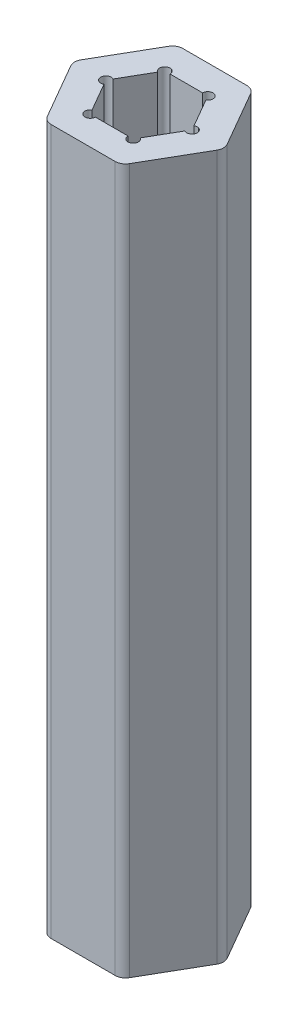
ISO-10303-21;
HEADER;
FILE_DESCRIPTION(('STEP AP214'),'2;1');
FILE_NAME('part.step','',(''),(''),'','','');
FILE_SCHEMA(('AUTOMOTIVE_DESIGN { 1 0 10303 214 1 1 1 1 }'));
ENDSEC;
DATA;
#1=APPLICATION_CONTEXT('core data for automotive mechanical design processes');
#2=APPLICATION_PROTOCOL_DEFINITION('international standard','automotive_design',2000,#1);
#3=PRODUCT_CONTEXT('',#1,'mechanical');
#4=PRODUCT('Part','Part','',(#3));
#5=PRODUCT_RELATED_PRODUCT_CATEGORY('part','',(#4));
#6=PRODUCT_DEFINITION_FORMATION('','',#4);
#7=PRODUCT_DEFINITION_CONTEXT('part definition',#1,'design');
#8=PRODUCT_DEFINITION('design','',#6,#7);
#9=PRODUCT_DEFINITION_SHAPE('','',#8);
#10=(LENGTH_UNIT() NAMED_UNIT(*) SI_UNIT(.MILLI.,.METRE.));
#11=(NAMED_UNIT(*) PLANE_ANGLE_UNIT() SI_UNIT($,.RADIAN.));
#12=(NAMED_UNIT(*) SI_UNIT($,.STERADIAN.) SOLID_ANGLE_UNIT());
#13=UNCERTAINTY_MEASURE_WITH_UNIT(LENGTH_MEASURE(1.E-05),#10,'distance_accuracy_value','');
#14=(GEOMETRIC_REPRESENTATION_CONTEXT(3) GLOBAL_UNCERTAINTY_ASSIGNED_CONTEXT((#13)) GLOBAL_UNIT_ASSIGNED_CONTEXT((#10,
#11,#12)) REPRESENTATION_CONTEXT('',''));
#15=CARTESIAN_POINT('',(0.,0.,0.));
#16=DIRECTION('',(0.,0.,1.));
#17=DIRECTION('',(1.,0.,0.));
#18=AXIS2_PLACEMENT_3D('',#15,#16,#17);
#19=CARTESIAN_POINT('',(0.,68.,0.));
#20=DIRECTION('',(0.,1.,0.));
#21=DIRECTION('',(0.,0.,1.));
#22=AXIS2_PLACEMENT_3D('',#19,#20,#21);
#23=PLANE('',#22);
#24=CARTESIAN_POINT('',(-4.1569219381653,68.,0.));
#25=DIRECTION('',(0.,1.,0.));
#26=DIRECTION('',(0.,0.,1.));
#27=AXIS2_PLACEMENT_3D('',#24,#25,#26);
#28=CIRCLE('',#27,0.5);
#29=CARTESIAN_POINT('',(-3.9069219381653,68.,-0.433012701892219));
#30=VERTEX_POINT('',#29);
#31=CARTESIAN_POINT('',(-3.9069219381653,68.,0.433012701892219));
#32=VERTEX_POINT('',#31);
#33=EDGE_CURVE('E741',#30,#32,#28,.T.);
#34=ORIENTED_EDGE('',*,*,#33,.F.);
#35=DIRECTION('',(-0.5,0.,0.866025403784439));
#36=VECTOR('',#35,1.);
#37=CARTESIAN_POINT('',(-2.07846096908265,68.,-3.6));
#38=LINE('',#37,#36);
#39=CARTESIAN_POINT('',(-2.32846096908265,68.,-3.16698729810778));
#40=VERTEX_POINT('',#39);
#41=EDGE_CURVE('E245',#40,#30,#38,.T.);
#42=ORIENTED_EDGE('',*,*,#41,.F.);
#43=CARTESIAN_POINT('',(-2.07846096908265,68.,-3.6));
#44=DIRECTION('',(0.,1.,0.));
#45=DIRECTION('',(0.,0.,1.));
#46=AXIS2_PLACEMENT_3D('',#43,#44,#45);
#47=CIRCLE('',#46,0.5);
#48=CARTESIAN_POINT('',(-1.57846096908265,68.,-3.6));
#49=VERTEX_POINT('',#48);
#50=EDGE_CURVE('E701',#49,#40,#47,.T.);
#51=ORIENTED_EDGE('',*,*,#50,.F.);
#52=DIRECTION('',(-1.,0.,0.));
#53=VECTOR('',#52,1.);
#54=CARTESIAN_POINT('',(2.07846096908265,68.,-3.6));
#55=LINE('',#54,#53);
#56=CARTESIAN_POINT('',(1.57846096908265,68.,-3.6));
#57=VERTEX_POINT('',#56);
#58=EDGE_CURVE('E239',#57,#49,#55,.T.);
#59=ORIENTED_EDGE('',*,*,#58,.F.);
#60=CARTESIAN_POINT('',(2.07846096908265,68.,-3.6));
#61=DIRECTION('',(0.,1.,0.));
#62=DIRECTION('',(0.,0.,1.));
#63=AXIS2_PLACEMENT_3D('',#60,#61,#62);
#64=CIRCLE('',#63,0.5);
#65=CARTESIAN_POINT('',(2.32846096908265,68.,-3.16698729810778));
#66=VERTEX_POINT('',#65);
#67=EDGE_CURVE('E237',#66,#57,#64,.T.);
#68=ORIENTED_EDGE('',*,*,#67,.F.);
#69=DIRECTION('',(-0.5,0.,-0.866025403784438));
#70=VECTOR('',#69,1.);
#71=CARTESIAN_POINT('',(4.15692193816531,68.,0.));
#72=LINE('',#71,#70);
#73=CARTESIAN_POINT('',(3.90692193816531,68.,-0.43301270189222));
#74=VERTEX_POINT('',#73);
#75=EDGE_CURVE('E227',#74,#66,#72,.T.);
#76=ORIENTED_EDGE('',*,*,#75,.F.);
#77=CARTESIAN_POINT('',(4.15692193816531,68.,0.));
#78=DIRECTION('',(0.,1.,0.));
#79=DIRECTION('',(0.,0.,1.));
#80=AXIS2_PLACEMENT_3D('',#77,#78,#79);
#81=CIRCLE('',#80,0.5);
#82=CARTESIAN_POINT('',(3.90692193816531,68.,0.433012701892218));
#83=VERTEX_POINT('',#82);
#84=EDGE_CURVE('E207',#83,#74,#81,.T.);
#85=ORIENTED_EDGE('',*,*,#84,.F.);
#86=DIRECTION('',(0.5,0.,-0.866025403784439));
#87=VECTOR('',#86,1.);
#88=CARTESIAN_POINT('',(2.07846096908265,68.,3.6));
#89=LINE('',#88,#87);
#90=CARTESIAN_POINT('',(2.32846096908265,68.,3.16698729810778));
#91=VERTEX_POINT('',#90);
#92=EDGE_CURVE('E265',#91,#83,#89,.T.);
#93=ORIENTED_EDGE('',*,*,#92,.F.);
#94=CARTESIAN_POINT('',(2.07846096908265,68.,3.6));
#95=DIRECTION('',(0.,1.,0.));
#96=DIRECTION('',(0.,0.,1.));
#97=AXIS2_PLACEMENT_3D('',#94,#95,#96);
#98=CIRCLE('',#97,0.5);
#99=CARTESIAN_POINT('',(1.57846096908265,68.,3.6));
#100=VERTEX_POINT('',#99);
#101=EDGE_CURVE('E725',#100,#91,#98,.T.);
#102=ORIENTED_EDGE('',*,*,#101,.F.);
#103=DIRECTION('',(1.,0.,0.));
#104=VECTOR('',#103,1.);
#105=CARTESIAN_POINT('',(-2.07846096908265,68.,3.6));
#106=LINE('',#105,#104);
#107=CARTESIAN_POINT('',(-1.57846096908265,68.,3.6));
#108=VERTEX_POINT('',#107);
#109=EDGE_CURVE('E261',#108,#100,#106,.T.);
#110=ORIENTED_EDGE('',*,*,#109,.F.);
#111=CARTESIAN_POINT('',(-2.07846096908265,68.,3.6));
#112=DIRECTION('',(0.,1.,0.));
#113=DIRECTION('',(0.,0.,1.));
#114=AXIS2_PLACEMENT_3D('',#111,#112,#113);
#115=CIRCLE('',#114,0.5);
#116=CARTESIAN_POINT('',(-2.32846096908265,68.,3.16698729810778));
#117=VERTEX_POINT('',#116);
#118=EDGE_CURVE('E734',#117,#108,#115,.T.);
#119=ORIENTED_EDGE('',*,*,#118,.F.);
#120=DIRECTION('',(0.5,0.,0.866025403784439));
#121=VECTOR('',#120,1.);
#122=CARTESIAN_POINT('',(-4.1569219381653,68.,0.));
#123=LINE('',#122,#121);
#124=EDGE_CURVE('E257',#32,#117,#123,.T.);
#125=ORIENTED_EDGE('',*,*,#124,.F.);
#126=EDGE_LOOP('',(#34,#42,#51,#59,#68,#76,#85,#93,#102,#110,#119,#125));
#127=FACE_BOUND('',#126,.T.);
#128=DIRECTION('',(0.5,0.,-0.866025403784439));
#129=VECTOR('',#128,1.);
#130=CARTESIAN_POINT('',(3.66617420935412,68.,6.35));
#131=LINE('',#130,#129);
#132=CARTESIAN_POINT('',(3.95484934394894,68.,5.85));
#133=VERTEX_POINT('',#132);
#134=CARTESIAN_POINT('',(7.04367328411343,68.,0.5));
#135=VERTEX_POINT('',#134);
#136=EDGE_CURVE('E305',#133,#135,#131,.T.);
#137=ORIENTED_EDGE('',*,*,#136,.T.);
#138=CARTESIAN_POINT('',(6.177647880329,68.,0.));
#139=DIRECTION('',(0.,1.,0.));
#140=DIRECTION('',(0.,0.,1.));
#141=AXIS2_PLACEMENT_3D('',#138,#139,#140);
#142=CIRCLE('',#141,1.);
#143=CARTESIAN_POINT('',(7.04367328411343,68.,-0.500000000000001));
#144=VERTEX_POINT('',#143);
#145=EDGE_CURVE('E393',#135,#144,#142,.T.);
#146=ORIENTED_EDGE('',*,*,#145,.T.);
#147=DIRECTION('',(-0.5,0.,-0.866025403784438));
#148=VECTOR('',#147,1.);
#149=CARTESIAN_POINT('',(7.33234841870825,68.,0.));
#150=LINE('',#149,#148);
#151=CARTESIAN_POINT('',(3.95484934394894,68.,-5.85));
#152=VERTEX_POINT('',#151);
#153=EDGE_CURVE('E286',#144,#152,#150,.T.);
#154=ORIENTED_EDGE('',*,*,#153,.T.);
#155=CARTESIAN_POINT('',(3.0888239401645,68.,-5.35));
#156=DIRECTION('',(0.,1.,0.));
#157=DIRECTION('',(0.,0.,1.));
#158=AXIS2_PLACEMENT_3D('',#155,#156,#157);
#159=CIRCLE('',#158,1.);
#160=CARTESIAN_POINT('',(3.0888239401645,68.,-6.35));
#161=VERTEX_POINT('',#160);
#162=EDGE_CURVE('E382',#152,#161,#159,.T.);
#163=ORIENTED_EDGE('',*,*,#162,.T.);
#164=DIRECTION('',(-1.,0.,0.));
#165=VECTOR('',#164,1.);
#166=CARTESIAN_POINT('',(3.66617420935412,68.,-6.35));
#167=LINE('',#166,#165);
#168=CARTESIAN_POINT('',(-3.0888239401645,68.,-6.35));
#169=VERTEX_POINT('',#168);
#170=EDGE_CURVE('E290',#161,#169,#167,.T.);
#171=ORIENTED_EDGE('',*,*,#170,.T.);
#172=CARTESIAN_POINT('',(-3.0888239401645,68.,-5.35));
#173=DIRECTION('',(0.,1.,0.));
#174=DIRECTION('',(0.,0.,1.));
#175=AXIS2_PLACEMENT_3D('',#172,#173,#174);
#176=CIRCLE('',#175,1.);
#177=CARTESIAN_POINT('',(-3.95484934394894,68.,-5.85));
#178=VERTEX_POINT('',#177);
#179=EDGE_CURVE('E385',#169,#178,#176,.T.);
#180=ORIENTED_EDGE('',*,*,#179,.T.);
#181=DIRECTION('',(-0.5,0.,0.866025403784439));
#182=VECTOR('',#181,1.);
#183=CARTESIAN_POINT('',(-3.66617420935412,68.,-6.35));
#184=LINE('',#183,#182);
#185=CARTESIAN_POINT('',(-7.04367328411343,68.,-0.5));
#186=VERTEX_POINT('',#185);
#187=EDGE_CURVE('E295',#178,#186,#184,.T.);
#188=ORIENTED_EDGE('',*,*,#187,.T.);
#189=CARTESIAN_POINT('',(-6.17764788032899,68.,0.));
#190=DIRECTION('',(0.,1.,0.));
#191=DIRECTION('',(0.,0.,1.));
#192=AXIS2_PLACEMENT_3D('',#189,#190,#191);
#193=CIRCLE('',#192,1.);
#194=CARTESIAN_POINT('',(-7.04367328411343,68.,0.5));
#195=VERTEX_POINT('',#194);
#196=EDGE_CURVE('E388',#186,#195,#193,.T.);
#197=ORIENTED_EDGE('',*,*,#196,.T.);
#198=DIRECTION('',(0.5,0.,0.866025403784439));
#199=VECTOR('',#198,1.);
#200=CARTESIAN_POINT('',(-7.33234841870824,68.,0.));
#201=LINE('',#200,#199);
#202=CARTESIAN_POINT('',(-3.95484934394893,68.,5.85));
#203=VERTEX_POINT('',#202);
#204=EDGE_CURVE('E299',#195,#203,#201,.T.);
#205=ORIENTED_EDGE('',*,*,#204,.T.);
#206=CARTESIAN_POINT('',(-3.08882394016449,68.,5.35));
#207=DIRECTION('',(0.,1.,0.));
#208=DIRECTION('',(0.,0.,1.));
#209=AXIS2_PLACEMENT_3D('',#206,#207,#208);
#210=CIRCLE('',#209,1.);
#211=CARTESIAN_POINT('',(-3.08882394016449,68.,6.35));
#212=VERTEX_POINT('',#211);
#213=EDGE_CURVE('E68',#203,#212,#210,.T.);
#214=ORIENTED_EDGE('',*,*,#213,.T.);
#215=DIRECTION('',(1.,0.,0.));
#216=VECTOR('',#215,1.);
#217=CARTESIAN_POINT('',(-3.66617420935412,68.,6.35));
#218=LINE('',#217,#216);
#219=CARTESIAN_POINT('',(3.0888239401645,68.,6.35));
#220=VERTEX_POINT('',#219);
#221=EDGE_CURVE('E302',#212,#220,#218,.T.);
#222=ORIENTED_EDGE('',*,*,#221,.T.);
#223=CARTESIAN_POINT('',(3.0888239401645,68.,5.35));
#224=DIRECTION('',(0.,1.,0.));
#225=DIRECTION('',(0.,0.,1.));
#226=AXIS2_PLACEMENT_3D('',#223,#224,#225);
#227=CIRCLE('',#226,1.);
#228=EDGE_CURVE('E379',#220,#133,#227,.T.);
#229=ORIENTED_EDGE('',*,*,#228,.T.);
#230=EDGE_LOOP('',(#137,#146,#154,#163,#171,#180,#188,#197,#205,#214,#222,#229));
#231=FACE_BOUND('',#230,.T.);
#232=ADVANCED_FACE('F45',(#127,#231),#23,.T.);
#233=CARTESIAN_POINT('',(0.,0.,0.));
#234=DIRECTION('',(0.,1.,0.));
#235=DIRECTION('',(0.,0.,1.));
#236=AXIS2_PLACEMENT_3D('',#233,#234,#235);
#237=PLANE('',#236);
#238=DIRECTION('',(-0.5,0.,-0.866025403784438));
#239=VECTOR('',#238,1.);
#240=CARTESIAN_POINT('',(7.33234841870825,0.,0.));
#241=LINE('',#240,#239);
#242=CARTESIAN_POINT('',(7.04367328411343,0.,-0.500000000000001));
#243=VERTEX_POINT('',#242);
#244=CARTESIAN_POINT('',(3.95484934394894,0.,-5.85));
#245=VERTEX_POINT('',#244);
#246=EDGE_CURVE('E268',#243,#245,#241,.T.);
#247=ORIENTED_EDGE('',*,*,#246,.F.);
#248=CARTESIAN_POINT('',(6.177647880329,0.,0.));
#249=DIRECTION('',(0.,1.,0.));
#250=DIRECTION('',(0.,0.,1.));
#251=AXIS2_PLACEMENT_3D('',#248,#249,#250);
#252=CIRCLE('',#251,1.);
#253=CARTESIAN_POINT('',(7.04367328411343,0.,0.5));
#254=VERTEX_POINT('',#253);
#255=EDGE_CURVE('E369',#243,#254,#252,.F.);
#256=ORIENTED_EDGE('',*,*,#255,.T.);
#257=DIRECTION('',(0.5,0.,-0.866025403784439));
#258=VECTOR('',#257,1.);
#259=CARTESIAN_POINT('',(3.66617420935412,0.,6.35));
#260=LINE('',#259,#258);
#261=CARTESIAN_POINT('',(3.95484934394894,0.,5.85));
#262=VERTEX_POINT('',#261);
#263=EDGE_CURVE('E291',#262,#254,#260,.T.);
#264=ORIENTED_EDGE('',*,*,#263,.F.);
#265=CARTESIAN_POINT('',(3.0888239401645,0.,5.35));
#266=DIRECTION('',(0.,1.,0.));
#267=DIRECTION('',(0.,0.,1.));
#268=AXIS2_PLACEMENT_3D('',#265,#266,#267);
#269=CIRCLE('',#268,1.);
#270=CARTESIAN_POINT('',(3.0888239401645,0.,6.35));
#271=VERTEX_POINT('',#270);
#272=EDGE_CURVE('E354',#262,#271,#269,.F.);
#273=ORIENTED_EDGE('',*,*,#272,.T.);
#274=DIRECTION('',(1.,0.,0.));
#275=VECTOR('',#274,1.);
#276=CARTESIAN_POINT('',(-3.66617420935412,0.,6.35));
#277=LINE('',#276,#275);
#278=CARTESIAN_POINT('',(-3.08882394016449,0.,6.35));
#279=VERTEX_POINT('',#278);
#280=EDGE_CURVE('E324',#279,#271,#277,.T.);
#281=ORIENTED_EDGE('',*,*,#280,.F.);
#282=CARTESIAN_POINT('',(-3.08882394016449,0.,5.35));
#283=DIRECTION('',(0.,1.,0.));
#284=DIRECTION('',(0.,0.,1.));
#285=AXIS2_PLACEMENT_3D('',#282,#283,#284);
#286=CIRCLE('',#285,1.);
#287=CARTESIAN_POINT('',(-3.95484934394893,0.,5.85));
#288=VERTEX_POINT('',#287);
#289=EDGE_CURVE('E366',#279,#288,#286,.F.);
#290=ORIENTED_EDGE('',*,*,#289,.T.);
#291=DIRECTION('',(0.5,0.,0.866025403784439));
#292=VECTOR('',#291,1.);
#293=CARTESIAN_POINT('',(-7.33234841870824,0.,0.));
#294=LINE('',#293,#292);
#295=CARTESIAN_POINT('',(-7.04367328411343,0.,0.5));
#296=VERTEX_POINT('',#295);
#297=EDGE_CURVE('E320',#296,#288,#294,.T.);
#298=ORIENTED_EDGE('',*,*,#297,.F.);
#299=CARTESIAN_POINT('',(-6.17764788032899,0.,0.));
#300=DIRECTION('',(0.,1.,0.));
#301=DIRECTION('',(0.,0.,1.));
#302=AXIS2_PLACEMENT_3D('',#299,#300,#301);
#303=CIRCLE('',#302,1.);
#304=CARTESIAN_POINT('',(-7.04367328411343,0.,-0.5));
#305=VERTEX_POINT('',#304);
#306=EDGE_CURVE('E363',#296,#305,#303,.F.);
#307=ORIENTED_EDGE('',*,*,#306,.T.);
#308=DIRECTION('',(-0.5,0.,0.866025403784439));
#309=VECTOR('',#308,1.);
#310=CARTESIAN_POINT('',(-3.66617420935412,0.,-6.35));
#311=LINE('',#310,#309);
#312=CARTESIAN_POINT('',(-3.95484934394894,0.,-5.85));
#313=VERTEX_POINT('',#312);
#314=EDGE_CURVE('E316',#313,#305,#311,.T.);
#315=ORIENTED_EDGE('',*,*,#314,.F.);
#316=CARTESIAN_POINT('',(-3.0888239401645,0.,-5.35));
#317=DIRECTION('',(0.,1.,0.));
#318=DIRECTION('',(0.,0.,1.));
#319=AXIS2_PLACEMENT_3D('',#316,#317,#318);
#320=CIRCLE('',#319,1.);
#321=CARTESIAN_POINT('',(-3.0888239401645,0.,-6.35));
#322=VERTEX_POINT('',#321);
#323=EDGE_CURVE('E360',#313,#322,#320,.F.);
#324=ORIENTED_EDGE('',*,*,#323,.T.);
#325=DIRECTION('',(-1.,0.,0.));
#326=VECTOR('',#325,1.);
#327=CARTESIAN_POINT('',(3.66617420935412,0.,-6.35));
#328=LINE('',#327,#326);
#329=CARTESIAN_POINT('',(3.0888239401645,0.,-6.35));
#330=VERTEX_POINT('',#329);
#331=EDGE_CURVE('E312',#330,#322,#328,.T.);
#332=ORIENTED_EDGE('',*,*,#331,.F.);
#333=CARTESIAN_POINT('',(3.0888239401645,0.,-5.35));
#334=DIRECTION('',(0.,1.,0.));
#335=DIRECTION('',(0.,0.,1.));
#336=AXIS2_PLACEMENT_3D('',#333,#334,#335);
#337=CIRCLE('',#336,1.);
#338=EDGE_CURVE('E357',#330,#245,#337,.F.);
#339=ORIENTED_EDGE('',*,*,#338,.T.);
#340=EDGE_LOOP('',(#247,#256,#264,#273,#281,#290,#298,#307,#315,#324,#332,#339));
#341=FACE_BOUND('',#340,.T.);
#342=DIRECTION('',(-0.5,0.,0.866025403784439));
#343=VECTOR('',#342,1.);
#344=CARTESIAN_POINT('',(-2.07846096908265,0.,-3.6));
#345=LINE('',#344,#343);
#346=CARTESIAN_POINT('',(-2.32846096908265,0.,-3.16698729810778));
#347=VERTEX_POINT('',#346);
#348=CARTESIAN_POINT('',(-3.9069219381653,0.,-0.433012701892219));
#349=VERTEX_POINT('',#348);
#350=EDGE_CURVE('E275',#347,#349,#345,.T.);
#351=ORIENTED_EDGE('',*,*,#350,.T.);
#352=CARTESIAN_POINT('',(-4.1569219381653,0.,0.));
#353=DIRECTION('',(0.,1.,0.));
#354=DIRECTION('',(0.,0.,1.));
#355=AXIS2_PLACEMENT_3D('',#352,#353,#354);
#356=CIRCLE('',#355,0.5);
#357=CARTESIAN_POINT('',(-3.9069219381653,0.,0.433012701892219));
#358=VERTEX_POINT('',#357);
#359=EDGE_CURVE('E743',#349,#358,#356,.T.);
#360=ORIENTED_EDGE('',*,*,#359,.T.);
#361=DIRECTION('',(0.5,0.,0.866025403784439));
#362=VECTOR('',#361,1.);
#363=CARTESIAN_POINT('',(-4.1569219381653,0.,0.));
#364=LINE('',#363,#362);
#365=CARTESIAN_POINT('',(-2.32846096908265,0.,3.16698729810778));
#366=VERTEX_POINT('',#365);
#367=EDGE_CURVE('E279',#358,#366,#364,.T.);
#368=ORIENTED_EDGE('',*,*,#367,.T.);
#369=CARTESIAN_POINT('',(-2.07846096908265,0.,3.6));
#370=DIRECTION('',(0.,1.,0.));
#371=DIRECTION('',(0.,0.,1.));
#372=AXIS2_PLACEMENT_3D('',#369,#370,#371);
#373=CIRCLE('',#372,0.5);
#374=CARTESIAN_POINT('',(-1.57846096908265,0.,3.6));
#375=VERTEX_POINT('',#374);
#376=EDGE_CURVE('E737',#366,#375,#373,.T.);
#377=ORIENTED_EDGE('',*,*,#376,.T.);
#378=DIRECTION('',(1.,0.,0.));
#379=VECTOR('',#378,1.);
#380=CARTESIAN_POINT('',(-2.07846096908265,0.,3.6));
#381=LINE('',#380,#379);
#382=CARTESIAN_POINT('',(1.57846096908265,0.,3.6));
#383=VERTEX_POINT('',#382);
#384=EDGE_CURVE('E248',#375,#383,#381,.T.);
#385=ORIENTED_EDGE('',*,*,#384,.T.);
#386=CARTESIAN_POINT('',(2.07846096908265,0.,3.6));
#387=DIRECTION('',(0.,1.,0.));
#388=DIRECTION('',(0.,0.,1.));
#389=AXIS2_PLACEMENT_3D('',#386,#387,#388);
#390=CIRCLE('',#389,0.5);
#391=CARTESIAN_POINT('',(2.32846096908265,0.,3.16698729810778));
#392=VERTEX_POINT('',#391);
#393=EDGE_CURVE('E728',#383,#392,#390,.T.);
#394=ORIENTED_EDGE('',*,*,#393,.T.);
#395=DIRECTION('',(0.5,0.,-0.866025403784439));
#396=VECTOR('',#395,1.);
#397=CARTESIAN_POINT('',(2.07846096908265,0.,3.6));
#398=LINE('',#397,#396);
#399=CARTESIAN_POINT('',(3.90692193816531,0.,0.43301270189222));
#400=VERTEX_POINT('',#399);
#401=EDGE_CURVE('E240',#392,#400,#398,.T.);
#402=ORIENTED_EDGE('',*,*,#401,.T.);
#403=CARTESIAN_POINT('',(4.15692193816531,0.,0.));
#404=DIRECTION('',(0.,1.,0.));
#405=DIRECTION('',(0.,0.,1.));
#406=AXIS2_PLACEMENT_3D('',#403,#404,#405);
#407=CIRCLE('',#406,0.5);
#408=CARTESIAN_POINT('',(3.90692193816531,0.,-0.43301270189222));
#409=VERTEX_POINT('',#408);
#410=EDGE_CURVE('E220',#400,#409,#407,.T.);
#411=ORIENTED_EDGE('',*,*,#410,.T.);
#412=DIRECTION('',(-0.5,0.,-0.866025403784438));
#413=VECTOR('',#412,1.);
#414=CARTESIAN_POINT('',(4.15692193816531,0.,0.));
#415=LINE('',#414,#413);
#416=CARTESIAN_POINT('',(2.32846096908265,0.,-3.16698729810778));
#417=VERTEX_POINT('',#416);
#418=EDGE_CURVE('E229',#409,#417,#415,.T.);
#419=ORIENTED_EDGE('',*,*,#418,.T.);
#420=CARTESIAN_POINT('',(2.07846096908265,0.,-3.6));
#421=DIRECTION('',(0.,1.,0.));
#422=DIRECTION('',(0.,0.,1.));
#423=AXIS2_PLACEMENT_3D('',#420,#421,#422);
#424=CIRCLE('',#423,0.5);
#425=CARTESIAN_POINT('',(1.57846096908265,0.,-3.6));
#426=VERTEX_POINT('',#425);
#427=EDGE_CURVE('E219',#417,#426,#424,.T.);
#428=ORIENTED_EDGE('',*,*,#427,.T.);
#429=DIRECTION('',(-1.,0.,0.));
#430=VECTOR('',#429,1.);
#431=CARTESIAN_POINT('',(2.07846096908265,0.,-3.6));
#432=LINE('',#431,#430);
#433=CARTESIAN_POINT('',(-1.57846096908265,0.,-3.6));
#434=VERTEX_POINT('',#433);
#435=EDGE_CURVE('E271',#426,#434,#432,.T.);
#436=ORIENTED_EDGE('',*,*,#435,.T.);
#437=CARTESIAN_POINT('',(-2.07846096908265,0.,-3.6));
#438=DIRECTION('',(0.,1.,0.));
#439=DIRECTION('',(0.,0.,1.));
#440=AXIS2_PLACEMENT_3D('',#437,#438,#439);
#441=CIRCLE('',#440,0.5);
#442=EDGE_CURVE('E232',#434,#347,#441,.T.);
#443=ORIENTED_EDGE('',*,*,#442,.T.);
#444=EDGE_LOOP('',(#351,#360,#368,#377,#385,#394,#402,#411,#419,#428,#436,#443));
#445=FACE_BOUND('',#444,.T.);
#446=ADVANCED_FACE('F427',(#341,#445),#237,.F.);
#447=CARTESIAN_POINT('',(7.33234841870825,68.,0.));
#448=DIRECTION('',(-0.866025403784439,0.,0.5));
#449=DIRECTION('',(0.5,0.,0.866025403784438));
#450=AXIS2_PLACEMENT_3D('',#447,#448,#449);
#451=PLANE('',#450);
#452=ORIENTED_EDGE('',*,*,#153,.F.);
#453=DIRECTION('',(0.,-1.,0.));
#454=VECTOR('',#453,1.);
#455=CARTESIAN_POINT('',(7.04367328411343,68.,-0.500000000000001));
#456=LINE('',#455,#454);
#457=EDGE_CURVE('E350',#144,#243,#456,.T.);
#458=ORIENTED_EDGE('',*,*,#457,.T.);
#459=ORIENTED_EDGE('',*,*,#246,.T.);
#460=DIRECTION('',(0.,-1.,0.));
#461=VECTOR('',#460,1.);
#462=CARTESIAN_POINT('',(3.95484934394894,68.,-5.85));
#463=LINE('',#462,#461);
#464=EDGE_CURVE('E347',#245,#152,#463,.F.);
#465=ORIENTED_EDGE('',*,*,#464,.T.);
#466=EDGE_LOOP('',(#452,#458,#459,#465));
#467=FACE_BOUND('',#466,.T.);
#468=ADVANCED_FACE('F466',(#467),#451,.F.);
#469=CARTESIAN_POINT('',(3.66617420935412,68.,-6.35));
#470=DIRECTION('',(0.,0.,1.));
#471=DIRECTION('',(1.,0.,0.));
#472=AXIS2_PLACEMENT_3D('',#469,#470,#471);
#473=PLANE('',#472);
#474=ORIENTED_EDGE('',*,*,#331,.T.);
#475=DIRECTION('',(0.,-1.,0.));
#476=VECTOR('',#475,1.);
#477=CARTESIAN_POINT('',(-3.0888239401645,68.,-6.35));
#478=LINE('',#477,#476);
#479=EDGE_CURVE('E11',#322,#169,#478,.F.);
#480=ORIENTED_EDGE('',*,*,#479,.T.);
#481=ORIENTED_EDGE('',*,*,#170,.F.);
#482=DIRECTION('',(0.,-1.,0.));
#483=VECTOR('',#482,1.);
#484=CARTESIAN_POINT('',(3.0888239401645,68.,-6.35));
#485=LINE('',#484,#483);
#486=EDGE_CURVE('E54',#161,#330,#485,.T.);
#487=ORIENTED_EDGE('',*,*,#486,.T.);
#488=EDGE_LOOP('',(#474,#480,#481,#487));
#489=FACE_BOUND('',#488,.T.);
#490=ADVANCED_FACE('F421',(#489),#473,.F.);
#491=CARTESIAN_POINT('',(-3.66617420935412,68.,-6.35));
#492=DIRECTION('',(0.866025403784439,0.,0.5));
#493=DIRECTION('',(0.5,0.,-0.866025403784439));
#494=AXIS2_PLACEMENT_3D('',#491,#492,#493);
#495=PLANE('',#494);
#496=ORIENTED_EDGE('',*,*,#314,.T.);
#497=DIRECTION('',(0.,-1.,0.));
#498=VECTOR('',#497,1.);
#499=CARTESIAN_POINT('',(-7.04367328411343,68.,-0.5));
#500=LINE('',#499,#498);
#501=EDGE_CURVE('E413',#305,#186,#500,.F.);
#502=ORIENTED_EDGE('',*,*,#501,.T.);
#503=ORIENTED_EDGE('',*,*,#187,.F.);
#504=DIRECTION('',(0.,-1.,0.));
#505=VECTOR('',#504,1.);
#506=CARTESIAN_POINT('',(-3.95484934394894,68.,-5.85));
#507=LINE('',#506,#505);
#508=EDGE_CURVE('E409',#178,#313,#507,.T.);
#509=ORIENTED_EDGE('',*,*,#508,.T.);
#510=EDGE_LOOP('',(#496,#502,#503,#509));
#511=FACE_BOUND('',#510,.T.);
#512=ADVANCED_FACE('F436',(#511),#495,.F.);
#513=CARTESIAN_POINT('',(-7.33234841870824,68.,0.));
#514=DIRECTION('',(0.866025403784439,0.,-0.5));
#515=DIRECTION('',(-0.5,0.,-0.866025403784439));
#516=AXIS2_PLACEMENT_3D('',#513,#514,#515);
#517=PLANE('',#516);
#518=ORIENTED_EDGE('',*,*,#297,.T.);
#519=DIRECTION('',(0.,-1.,0.));
#520=VECTOR('',#519,1.);
#521=CARTESIAN_POINT('',(-3.95484934394893,68.,5.85));
#522=LINE('',#521,#520);
#523=EDGE_CURVE('E406',#288,#203,#522,.F.);
#524=ORIENTED_EDGE('',*,*,#523,.T.);
#525=ORIENTED_EDGE('',*,*,#204,.F.);
#526=DIRECTION('',(0.,-1.,0.));
#527=VECTOR('',#526,1.);
#528=CARTESIAN_POINT('',(-7.04367328411343,68.,0.499999999999999));
#529=LINE('',#528,#527);
#530=EDGE_CURVE('E402',#195,#296,#529,.T.);
#531=ORIENTED_EDGE('',*,*,#530,.T.);
#532=EDGE_LOOP('',(#518,#524,#525,#531));
#533=FACE_BOUND('',#532,.T.);
#534=ADVANCED_FACE('F445',(#533),#517,.F.);
#535=CARTESIAN_POINT('',(-3.66617420935412,68.,6.35));
#536=DIRECTION('',(0.,0.,-1.));
#537=DIRECTION('',(-1.,0.,0.));
#538=AXIS2_PLACEMENT_3D('',#535,#536,#537);
#539=PLANE('',#538);
#540=ORIENTED_EDGE('',*,*,#221,.F.);
#541=DIRECTION('',(0.,-1.,0.));
#542=VECTOR('',#541,1.);
#543=CARTESIAN_POINT('',(-3.08882394016449,68.,6.35));
#544=LINE('',#543,#542);
#545=EDGE_CURVE('E398',#212,#279,#544,.T.);
#546=ORIENTED_EDGE('',*,*,#545,.T.);
#547=ORIENTED_EDGE('',*,*,#280,.T.);
#548=DIRECTION('',(0.,-1.,0.));
#549=VECTOR('',#548,1.);
#550=CARTESIAN_POINT('',(3.0888239401645,68.,6.35));
#551=LINE('',#550,#549);
#552=EDGE_CURVE('E61',#271,#220,#551,.F.);
#553=ORIENTED_EDGE('',*,*,#552,.T.);
#554=EDGE_LOOP('',(#540,#546,#547,#553));
#555=FACE_BOUND('',#554,.T.);
#556=ADVANCED_FACE('F451',(#555),#539,.F.);
#557=CARTESIAN_POINT('',(3.66617420935412,68.,6.35));
#558=DIRECTION('',(-0.866025403784439,0.,-0.5));
#559=DIRECTION('',(-0.5,0.,0.866025403784439));
#560=AXIS2_PLACEMENT_3D('',#557,#558,#559);
#561=PLANE('',#560);
#562=ORIENTED_EDGE('',*,*,#263,.T.);
#563=DIRECTION('',(0.,-1.,0.));
#564=VECTOR('',#563,1.);
#565=CARTESIAN_POINT('',(7.04367328411343,68.,0.499999999999999));
#566=LINE('',#565,#564);
#567=EDGE_CURVE('E376',#254,#135,#566,.F.);
#568=ORIENTED_EDGE('',*,*,#567,.T.);
#569=ORIENTED_EDGE('',*,*,#136,.F.);
#570=DIRECTION('',(0.,-1.,0.));
#571=VECTOR('',#570,1.);
#572=CARTESIAN_POINT('',(3.95484934394894,68.,5.85));
#573=LINE('',#572,#571);
#574=EDGE_CURVE('E372',#133,#262,#573,.T.);
#575=ORIENTED_EDGE('',*,*,#574,.T.);
#576=EDGE_LOOP('',(#562,#568,#569,#575));
#577=FACE_BOUND('',#576,.T.);
#578=ADVANCED_FACE('F458',(#577),#561,.F.);
#579=CARTESIAN_POINT('',(4.15692193816531,68.,0.));
#580=DIRECTION('',(-0.866025403784439,0.,0.5));
#581=DIRECTION('',(0.5,0.,0.866025403784438));
#582=AXIS2_PLACEMENT_3D('',#579,#580,#581);
#583=PLANE('',#582);
#584=DIRECTION('',(0.,1.,0.));
#585=VECTOR('',#584,1.);
#586=CARTESIAN_POINT('',(3.90692193816531,0.,-0.43301270189222));
#587=LINE('',#586,#585);
#588=EDGE_CURVE('E210',#74,#409,#587,.F.);
#589=ORIENTED_EDGE('',*,*,#588,.F.);
#590=ORIENTED_EDGE('',*,*,#75,.T.);
#591=DIRECTION('',(0.,1.,0.));
#592=VECTOR('',#591,1.);
#593=CARTESIAN_POINT('',(2.32846096908265,0.,-3.16698729810778));
#594=LINE('',#593,#592);
#595=EDGE_CURVE('E251',#417,#66,#594,.T.);
#596=ORIENTED_EDGE('',*,*,#595,.F.);
#597=ORIENTED_EDGE('',*,*,#418,.F.);
#598=EDGE_LOOP('',(#589,#590,#596,#597));
#599=FACE_BOUND('',#598,.T.);
#600=ADVANCED_FACE('F225',(#599),#583,.T.);
#601=CARTESIAN_POINT('',(2.07846096908265,68.,-3.6));
#602=DIRECTION('',(0.,0.,1.));
#603=DIRECTION('',(1.,0.,0.));
#604=AXIS2_PLACEMENT_3D('',#601,#602,#603);
#605=PLANE('',#604);
#606=DIRECTION('',(0.,1.,0.));
#607=VECTOR('',#606,1.);
#608=CARTESIAN_POINT('',(1.57846096908265,0.,-3.6));
#609=LINE('',#608,#607);
#610=EDGE_CURVE('E344',#57,#426,#609,.F.);
#611=ORIENTED_EDGE('',*,*,#610,.F.);
#612=ORIENTED_EDGE('',*,*,#58,.T.);
#613=DIRECTION('',(0.,1.,0.));
#614=VECTOR('',#613,1.);
#615=CARTESIAN_POINT('',(-1.57846096908265,0.,-3.6));
#616=LINE('',#615,#614);
#617=EDGE_CURVE('E719',#434,#49,#616,.T.);
#618=ORIENTED_EDGE('',*,*,#617,.F.);
#619=ORIENTED_EDGE('',*,*,#435,.F.);
#620=EDGE_LOOP('',(#611,#612,#618,#619));
#621=FACE_BOUND('',#620,.T.);
#622=ADVANCED_FACE('F619',(#621),#605,.T.);
#623=CARTESIAN_POINT('',(-2.07846096908265,68.,-3.6));
#624=DIRECTION('',(0.866025403784439,0.,0.5));
#625=DIRECTION('',(0.5,0.,-0.866025403784439));
#626=AXIS2_PLACEMENT_3D('',#623,#624,#625);
#627=PLANE('',#626);
#628=DIRECTION('',(0.,1.,0.));
#629=VECTOR('',#628,1.);
#630=CARTESIAN_POINT('',(-3.9069219381653,0.,-0.433012701892219));
#631=LINE('',#630,#629);
#632=EDGE_CURVE('E717',#349,#30,#631,.T.);
#633=ORIENTED_EDGE('',*,*,#632,.F.);
#634=ORIENTED_EDGE('',*,*,#350,.F.);
#635=DIRECTION('',(0.,1.,0.));
#636=VECTOR('',#635,1.);
#637=CARTESIAN_POINT('',(-2.32846096908265,0.,-3.16698729810778));
#638=LINE('',#637,#636);
#639=EDGE_CURVE('E341',#40,#347,#638,.F.);
#640=ORIENTED_EDGE('',*,*,#639,.F.);
#641=ORIENTED_EDGE('',*,*,#41,.T.);
#642=EDGE_LOOP('',(#633,#634,#640,#641));
#643=FACE_BOUND('',#642,.T.);
#644=ADVANCED_FACE('F610',(#643),#627,.T.);
#645=CARTESIAN_POINT('',(-4.1569219381653,68.,0.));
#646=DIRECTION('',(0.866025403784439,0.,-0.5));
#647=DIRECTION('',(-0.5,0.,-0.866025403784439));
#648=AXIS2_PLACEMENT_3D('',#645,#646,#647);
#649=PLANE('',#648);
#650=DIRECTION('',(0.,1.,0.));
#651=VECTOR('',#650,1.);
#652=CARTESIAN_POINT('',(-3.9069219381653,0.,0.433012701892219));
#653=LINE('',#652,#651);
#654=EDGE_CURVE('E338',#32,#358,#653,.F.);
#655=ORIENTED_EDGE('',*,*,#654,.F.);
#656=ORIENTED_EDGE('',*,*,#124,.T.);
#657=DIRECTION('',(0.,1.,0.));
#658=VECTOR('',#657,1.);
#659=CARTESIAN_POINT('',(-2.32846096908265,0.,3.16698729810778));
#660=LINE('',#659,#658);
#661=EDGE_CURVE('E714',#366,#117,#660,.T.);
#662=ORIENTED_EDGE('',*,*,#661,.F.);
#663=ORIENTED_EDGE('',*,*,#367,.F.);
#664=EDGE_LOOP('',(#655,#656,#662,#663));
#665=FACE_BOUND('',#664,.T.);
#666=ADVANCED_FACE('F601',(#665),#649,.T.);
#667=CARTESIAN_POINT('',(-2.07846096908265,68.,3.6));
#668=DIRECTION('',(0.,0.,-1.));
#669=DIRECTION('',(-1.,0.,0.));
#670=AXIS2_PLACEMENT_3D('',#667,#668,#669);
#671=PLANE('',#670);
#672=DIRECTION('',(0.,1.,0.));
#673=VECTOR('',#672,1.);
#674=CARTESIAN_POINT('',(-1.57846096908265,0.,3.6));
#675=LINE('',#674,#673);
#676=EDGE_CURVE('E335',#108,#375,#675,.F.);
#677=ORIENTED_EDGE('',*,*,#676,.F.);
#678=ORIENTED_EDGE('',*,*,#109,.T.);
#679=DIRECTION('',(0.,1.,0.));
#680=VECTOR('',#679,1.);
#681=CARTESIAN_POINT('',(1.57846096908265,0.,3.6));
#682=LINE('',#681,#680);
#683=EDGE_CURVE('E231',#383,#100,#682,.T.);
#684=ORIENTED_EDGE('',*,*,#683,.F.);
#685=ORIENTED_EDGE('',*,*,#384,.F.);
#686=EDGE_LOOP('',(#677,#678,#684,#685));
#687=FACE_BOUND('',#686,.T.);
#688=ADVANCED_FACE('F592',(#687),#671,.T.);
#689=CARTESIAN_POINT('',(2.07846096908265,68.,3.6));
#690=DIRECTION('',(-0.866025403784439,0.,-0.5));
#691=DIRECTION('',(-0.5,0.,0.866025403784439));
#692=AXIS2_PLACEMENT_3D('',#689,#690,#691);
#693=PLANE('',#692);
#694=DIRECTION('',(0.,1.,0.));
#695=VECTOR('',#694,1.);
#696=CARTESIAN_POINT('',(2.32846096908265,0.,3.16698729810778));
#697=LINE('',#696,#695);
#698=EDGE_CURVE('E332',#91,#392,#697,.F.);
#699=ORIENTED_EDGE('',*,*,#698,.F.);
#700=ORIENTED_EDGE('',*,*,#92,.T.);
#701=DIRECTION('',(0.,1.,0.));
#702=VECTOR('',#701,1.);
#703=CARTESIAN_POINT('',(3.90692193816531,0.,0.433012701892218));
#704=LINE('',#703,#702);
#705=EDGE_CURVE('E213',#400,#83,#704,.T.);
#706=ORIENTED_EDGE('',*,*,#705,.F.);
#707=ORIENTED_EDGE('',*,*,#401,.F.);
#708=EDGE_LOOP('',(#699,#700,#706,#707));
#709=FACE_BOUND('',#708,.T.);
#710=ADVANCED_FACE('F584',(#709),#693,.T.);
#711=CARTESIAN_POINT('',(4.15692193816531,0.,0.));
#712=DIRECTION('',(0.,1.,0.));
#713=DIRECTION('',(0.,0.,1.));
#714=AXIS2_PLACEMENT_3D('',#711,#712,#713);
#715=CYLINDRICAL_SURFACE('',#714,0.5);
#716=ORIENTED_EDGE('',*,*,#588,.T.);
#717=ORIENTED_EDGE('',*,*,#410,.F.);
#718=ORIENTED_EDGE('',*,*,#705,.T.);
#719=ORIENTED_EDGE('',*,*,#84,.T.);
#720=EDGE_LOOP('',(#716,#717,#718,#719));
#721=FACE_BOUND('',#720,.T.);
#722=ADVANCED_FACE('F209',(#721),#715,.F.);
#723=CARTESIAN_POINT('',(2.07846096908265,0.,3.6));
#724=DIRECTION('',(0.,1.,0.));
#725=DIRECTION('',(0.,0.,1.));
#726=AXIS2_PLACEMENT_3D('',#723,#724,#725);
#727=CYLINDRICAL_SURFACE('',#726,0.5);
#728=ORIENTED_EDGE('',*,*,#683,.T.);
#729=ORIENTED_EDGE('',*,*,#101,.T.);
#730=ORIENTED_EDGE('',*,*,#698,.T.);
#731=ORIENTED_EDGE('',*,*,#393,.F.);
#732=EDGE_LOOP('',(#728,#729,#730,#731));
#733=FACE_BOUND('',#732,.T.);
#734=ADVANCED_FACE('F567',(#733),#727,.F.);
#735=CARTESIAN_POINT('',(-2.07846096908265,0.,3.6));
#736=DIRECTION('',(0.,1.,0.));
#737=DIRECTION('',(0.,0.,1.));
#738=AXIS2_PLACEMENT_3D('',#735,#736,#737);
#739=CYLINDRICAL_SURFACE('',#738,0.5);
#740=ORIENTED_EDGE('',*,*,#661,.T.);
#741=ORIENTED_EDGE('',*,*,#118,.T.);
#742=ORIENTED_EDGE('',*,*,#676,.T.);
#743=ORIENTED_EDGE('',*,*,#376,.F.);
#744=EDGE_LOOP('',(#740,#741,#742,#743));
#745=FACE_BOUND('',#744,.T.);
#746=ADVANCED_FACE('F558',(#745),#739,.F.);
#747=CARTESIAN_POINT('',(-4.1569219381653,0.,0.));
#748=DIRECTION('',(0.,1.,0.));
#749=DIRECTION('',(0.,0.,1.));
#750=AXIS2_PLACEMENT_3D('',#747,#748,#749);
#751=CYLINDRICAL_SURFACE('',#750,0.5);
#752=ORIENTED_EDGE('',*,*,#632,.T.);
#753=ORIENTED_EDGE('',*,*,#33,.T.);
#754=ORIENTED_EDGE('',*,*,#654,.T.);
#755=ORIENTED_EDGE('',*,*,#359,.F.);
#756=EDGE_LOOP('',(#752,#753,#754,#755));
#757=FACE_BOUND('',#756,.T.);
#758=ADVANCED_FACE('F549',(#757),#751,.F.);
#759=CARTESIAN_POINT('',(-2.07846096908265,0.,-3.6));
#760=DIRECTION('',(0.,1.,0.));
#761=DIRECTION('',(0.,0.,1.));
#762=AXIS2_PLACEMENT_3D('',#759,#760,#761);
#763=CYLINDRICAL_SURFACE('',#762,0.5);
#764=ORIENTED_EDGE('',*,*,#617,.T.);
#765=ORIENTED_EDGE('',*,*,#50,.T.);
#766=ORIENTED_EDGE('',*,*,#639,.T.);
#767=ORIENTED_EDGE('',*,*,#442,.F.);
#768=EDGE_LOOP('',(#764,#765,#766,#767));
#769=FACE_BOUND('',#768,.T.);
#770=ADVANCED_FACE('F540',(#769),#763,.F.);
#771=CARTESIAN_POINT('',(2.07846096908265,0.,-3.6));
#772=DIRECTION('',(0.,1.,0.));
#773=DIRECTION('',(0.,0.,1.));
#774=AXIS2_PLACEMENT_3D('',#771,#772,#773);
#775=CYLINDRICAL_SURFACE('',#774,0.5);
#776=ORIENTED_EDGE('',*,*,#595,.T.);
#777=ORIENTED_EDGE('',*,*,#67,.T.);
#778=ORIENTED_EDGE('',*,*,#610,.T.);
#779=ORIENTED_EDGE('',*,*,#427,.F.);
#780=EDGE_LOOP('',(#776,#777,#778,#779));
#781=FACE_BOUND('',#780,.T.);
#782=ADVANCED_FACE('F499',(#781),#775,.F.);
#783=CARTESIAN_POINT('',(6.177647880329,68.,0.));
#784=DIRECTION('',(0.,-1.,0.));
#785=DIRECTION('',(0.,0.,-1.));
#786=AXIS2_PLACEMENT_3D('',#783,#784,#785);
#787=CYLINDRICAL_SURFACE('',#786,1.);
#788=ORIENTED_EDGE('',*,*,#145,.F.);
#789=ORIENTED_EDGE('',*,*,#567,.F.);
#790=ORIENTED_EDGE('',*,*,#255,.F.);
#791=ORIENTED_EDGE('',*,*,#457,.F.);
#792=EDGE_LOOP('',(#788,#789,#790,#791));
#793=FACE_BOUND('',#792,.T.);
#794=ADVANCED_FACE('F463',(#793),#787,.T.);
#795=CARTESIAN_POINT('',(-3.08882394016449,68.,5.35));
#796=DIRECTION('',(0.,-1.,0.));
#797=DIRECTION('',(0.,0.,-1.));
#798=AXIS2_PLACEMENT_3D('',#795,#796,#797);
#799=CYLINDRICAL_SURFACE('',#798,1.);
#800=ORIENTED_EDGE('',*,*,#213,.F.);
#801=ORIENTED_EDGE('',*,*,#523,.F.);
#802=ORIENTED_EDGE('',*,*,#289,.F.);
#803=ORIENTED_EDGE('',*,*,#545,.F.);
#804=EDGE_LOOP('',(#800,#801,#802,#803));
#805=FACE_BOUND('',#804,.T.);
#806=ADVANCED_FACE('F450',(#805),#799,.T.);
#807=CARTESIAN_POINT('',(-6.17764788032899,68.,0.));
#808=DIRECTION('',(0.,-1.,0.));
#809=DIRECTION('',(0.,0.,-1.));
#810=AXIS2_PLACEMENT_3D('',#807,#808,#809);
#811=CYLINDRICAL_SURFACE('',#810,1.);
#812=ORIENTED_EDGE('',*,*,#196,.F.);
#813=ORIENTED_EDGE('',*,*,#501,.F.);
#814=ORIENTED_EDGE('',*,*,#306,.F.);
#815=ORIENTED_EDGE('',*,*,#530,.F.);
#816=EDGE_LOOP('',(#812,#813,#814,#815));
#817=FACE_BOUND('',#816,.T.);
#818=ADVANCED_FACE('F442',(#817),#811,.T.);
#819=CARTESIAN_POINT('',(-3.0888239401645,68.,-5.35));
#820=DIRECTION('',(0.,-1.,0.));
#821=DIRECTION('',(0.,0.,-1.));
#822=AXIS2_PLACEMENT_3D('',#819,#820,#821);
#823=CYLINDRICAL_SURFACE('',#822,1.);
#824=ORIENTED_EDGE('',*,*,#179,.F.);
#825=ORIENTED_EDGE('',*,*,#479,.F.);
#826=ORIENTED_EDGE('',*,*,#323,.F.);
#827=ORIENTED_EDGE('',*,*,#508,.F.);
#828=EDGE_LOOP('',(#824,#825,#826,#827));
#829=FACE_BOUND('',#828,.T.);
#830=ADVANCED_FACE('F433',(#829),#823,.T.);
#831=CARTESIAN_POINT('',(3.0888239401645,68.,-5.35));
#832=DIRECTION('',(0.,-1.,0.));
#833=DIRECTION('',(0.,0.,-1.));
#834=AXIS2_PLACEMENT_3D('',#831,#832,#833);
#835=CYLINDRICAL_SURFACE('',#834,1.);
#836=ORIENTED_EDGE('',*,*,#162,.F.);
#837=ORIENTED_EDGE('',*,*,#464,.F.);
#838=ORIENTED_EDGE('',*,*,#338,.F.);
#839=ORIENTED_EDGE('',*,*,#486,.F.);
#840=EDGE_LOOP('',(#836,#837,#838,#839));
#841=FACE_BOUND('',#840,.T.);
#842=ADVANCED_FACE('F468',(#841),#835,.T.);
#843=CARTESIAN_POINT('',(3.0888239401645,68.,5.35));
#844=DIRECTION('',(0.,-1.,0.));
#845=DIRECTION('',(0.,0.,-1.));
#846=AXIS2_PLACEMENT_3D('',#843,#844,#845);
#847=CYLINDRICAL_SURFACE('',#846,1.);
#848=ORIENTED_EDGE('',*,*,#228,.F.);
#849=ORIENTED_EDGE('',*,*,#552,.F.);
#850=ORIENTED_EDGE('',*,*,#272,.F.);
#851=ORIENTED_EDGE('',*,*,#574,.F.);
#852=EDGE_LOOP('',(#848,#849,#850,#851));
#853=FACE_BOUND('',#852,.T.);
#854=ADVANCED_FACE('F47',(#853),#847,.T.);
#855=CLOSED_SHELL('',(#232,#446,#468,#490,#512,#534,#556,#578,#600,#622,#644,#666,#688,#710,
#722,#734,#746,#758,#770,#782,#794,#806,#818,#830,#842,#854));
#856=MANIFOLD_SOLID_BREP('B2',#855);
#857=ADVANCED_BREP_SHAPE_REPRESENTATION('',(#18,#856),#14);
#858=SHAPE_DEFINITION_REPRESENTATION(#9,#857);
ENDSEC;
END-ISO-10303-21;
